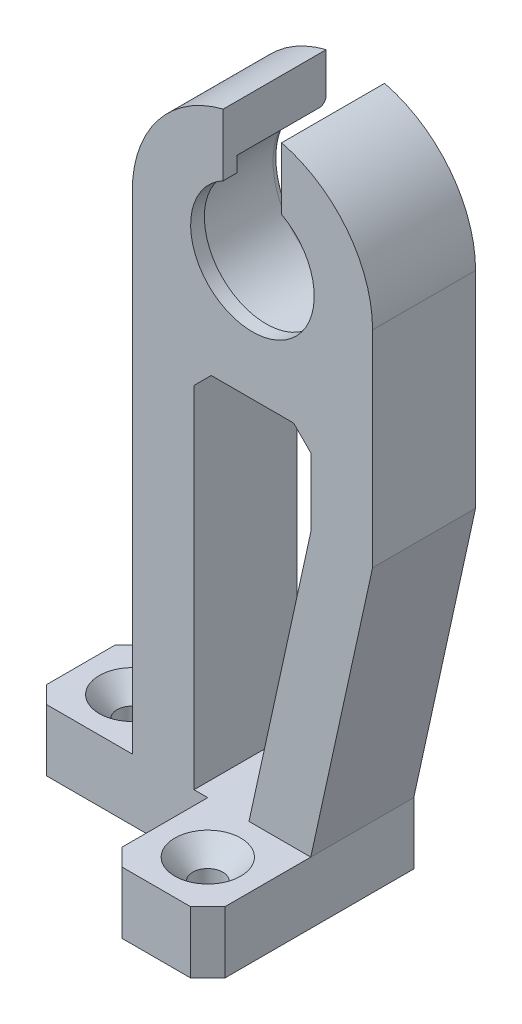
ISO-10303-21;
HEADER;
FILE_DESCRIPTION(('STEP AP214'),'2;1');
FILE_NAME('part.step','',(''),(''),'','','');
FILE_SCHEMA(('AUTOMOTIVE_DESIGN { 1 0 10303 214 1 1 1 1 }'));
ENDSEC;
DATA;
#1=APPLICATION_CONTEXT('core data for automotive mechanical design processes');
#2=APPLICATION_PROTOCOL_DEFINITION('international standard','automotive_design',2000,#1);
#3=PRODUCT_CONTEXT('',#1,'mechanical');
#4=PRODUCT('Part','Part','',(#3));
#5=PRODUCT_RELATED_PRODUCT_CATEGORY('part','',(#4));
#6=PRODUCT_DEFINITION_FORMATION('','',#4);
#7=PRODUCT_DEFINITION_CONTEXT('part definition',#1,'design');
#8=PRODUCT_DEFINITION('design','',#6,#7);
#9=PRODUCT_DEFINITION_SHAPE('','',#8);
#10=(LENGTH_UNIT() NAMED_UNIT(*) SI_UNIT(.MILLI.,.METRE.));
#11=(NAMED_UNIT(*) PLANE_ANGLE_UNIT() SI_UNIT($,.RADIAN.));
#12=(NAMED_UNIT(*) SI_UNIT($,.STERADIAN.) SOLID_ANGLE_UNIT());
#13=UNCERTAINTY_MEASURE_WITH_UNIT(LENGTH_MEASURE(1.E-05),#10,'distance_accuracy_value','');
#14=(GEOMETRIC_REPRESENTATION_CONTEXT(3) GLOBAL_UNCERTAINTY_ASSIGNED_CONTEXT((#13)) GLOBAL_UNIT_ASSIGNED_CONTEXT((#10,
#11,#12)) REPRESENTATION_CONTEXT('',''));
#15=CARTESIAN_POINT('',(0.,0.,0.));
#16=DIRECTION('',(0.,0.,1.));
#17=DIRECTION('',(1.,0.,0.));
#18=AXIS2_PLACEMENT_3D('',#15,#16,#17);
#19=CARTESIAN_POINT('',(0.,0.,15.));
#20=DIRECTION('',(0.,0.,-1.));
#21=DIRECTION('',(-1.,0.,0.));
#22=AXIS2_PLACEMENT_3D('',#19,#20,#21);
#23=CYLINDRICAL_SURFACE('',#22,11.);
#24=DIRECTION('',(0.,0.,-1.));
#25=VECTOR('',#24,1.);
#26=CARTESIAN_POINT('',(4.25,10.1458119438515,15.));
#27=LINE('',#26,#25);
#28=CARTESIAN_POINT('',(4.25,10.1458119438515,13.));
#29=VERTEX_POINT('',#28);
#30=CARTESIAN_POINT('',(4.25,10.1458119438515,1.));
#31=VERTEX_POINT('',#30);
#32=EDGE_CURVE('E389',#29,#31,#27,.T.);
#33=ORIENTED_EDGE('',*,*,#32,.T.);
#34=CARTESIAN_POINT('',(0.,0.,1.));
#35=DIRECTION('',(0.,0.,1.));
#36=DIRECTION('',(1.,0.,0.));
#37=AXIS2_PLACEMENT_3D('',#34,#35,#36);
#38=CIRCLE('',#37,11.);
#39=CARTESIAN_POINT('',(-4.25,10.1458119438515,1.));
#40=VERTEX_POINT('',#39);
#41=EDGE_CURVE('E407',#31,#40,#38,.F.);
#42=ORIENTED_EDGE('',*,*,#41,.T.);
#43=DIRECTION('',(0.,0.,-1.));
#44=VECTOR('',#43,1.);
#45=CARTESIAN_POINT('',(-4.25,10.1458119438515,15.));
#46=LINE('',#45,#44);
#47=CARTESIAN_POINT('',(-4.25,10.1458119438515,13.));
#48=VERTEX_POINT('',#47);
#49=EDGE_CURVE('E386',#48,#40,#46,.T.);
#50=ORIENTED_EDGE('',*,*,#49,.F.);
#51=CARTESIAN_POINT('',(0.,0.,13.));
#52=DIRECTION('',(0.,0.,1.));
#53=DIRECTION('',(1.,0.,0.));
#54=AXIS2_PLACEMENT_3D('',#51,#52,#53);
#55=CIRCLE('',#54,11.);
#56=EDGE_CURVE('E276',#29,#48,#55,.F.);
#57=ORIENTED_EDGE('',*,*,#56,.F.);
#58=EDGE_LOOP('',(#33,#42,#50,#57));
#59=FACE_BOUND('',#58,.T.);
#60=ADVANCED_FACE('F41',(#59),#23,.F.);
#61=CARTESIAN_POINT('',(0.,-17.5,15.));
#62=DIRECTION('',(0.,1.,0.));
#63=DIRECTION('',(0.,0.,1.));
#64=AXIS2_PLACEMENT_3D('',#61,#62,#63);
#65=PLANE('',#64);
#66=DIRECTION('',(1.,0.,0.));
#67=VECTOR('',#66,1.);
#68=CARTESIAN_POINT('',(0.,-17.5,0.));
#69=LINE('',#68,#67);
#70=CARTESIAN_POINT('',(-5.99999999999998,-17.5,0.));
#71=VERTEX_POINT('',#70);
#72=CARTESIAN_POINT('',(6.00000000000002,-17.5,0.));
#73=VERTEX_POINT('',#72);
#74=EDGE_CURVE('E346',#71,#73,#69,.T.);
#75=ORIENTED_EDGE('',*,*,#74,.T.);
#76=DIRECTION('',(0.,0.,1.));
#77=VECTOR('',#76,1.);
#78=CARTESIAN_POINT('',(6.00000000000002,-17.5,15.));
#79=LINE('',#78,#77);
#80=CARTESIAN_POINT('',(6.00000000000002,-17.5,15.));
#81=VERTEX_POINT('',#80);
#82=EDGE_CURVE('E587',#73,#81,#79,.T.);
#83=ORIENTED_EDGE('',*,*,#82,.T.);
#84=DIRECTION('',(1.,0.,0.));
#85=VECTOR('',#84,1.);
#86=CARTESIAN_POINT('',(0.,-17.5,15.));
#87=LINE('',#86,#85);
#88=CARTESIAN_POINT('',(-5.99999999999998,-17.5,15.));
#89=VERTEX_POINT('',#88);
#90=EDGE_CURVE('E306',#89,#81,#87,.T.);
#91=ORIENTED_EDGE('',*,*,#90,.F.);
#92=DIRECTION('',(0.,0.,-1.));
#93=VECTOR('',#92,1.);
#94=CARTESIAN_POINT('',(-5.99999999999998,-17.5,15.));
#95=LINE('',#94,#93);
#96=EDGE_CURVE('E584',#89,#71,#95,.T.);
#97=ORIENTED_EDGE('',*,*,#96,.T.);
#98=EDGE_LOOP('',(#75,#83,#91,#97));
#99=FACE_BOUND('',#98,.T.);
#100=ADVANCED_FACE('F435',(#99),#65,.F.);
#101=CARTESIAN_POINT('',(8.5,0.,15.));
#102=DIRECTION('',(1.,0.,0.));
#103=DIRECTION('',(0.,1.,0.));
#104=AXIS2_PLACEMENT_3D('',#101,#102,#103);
#105=PLANE('',#104);
#106=DIRECTION('',(0.,-1.,0.));
#107=VECTOR('',#106,1.);
#108=CARTESIAN_POINT('',(8.5,0.,15.));
#109=LINE('',#108,#107);
#110=CARTESIAN_POINT('',(8.5,-20.,15.));
#111=VERTEX_POINT('',#110);
#112=CARTESIAN_POINT('',(8.50000000000001,-30.,15.));
#113=VERTEX_POINT('',#112);
#114=EDGE_CURVE('E309',#111,#113,#109,.T.);
#115=ORIENTED_EDGE('',*,*,#114,.F.);
#116=DIRECTION('',(0.,0.,-1.));
#117=VECTOR('',#116,1.);
#118=CARTESIAN_POINT('',(8.5,-20.,0.));
#119=LINE('',#118,#117);
#120=CARTESIAN_POINT('',(8.5,-20.,0.));
#121=VERTEX_POINT('',#120);
#122=EDGE_CURVE('E581',#111,#121,#119,.T.);
#123=ORIENTED_EDGE('',*,*,#122,.T.);
#124=DIRECTION('',(0.,-1.,0.));
#125=VECTOR('',#124,1.);
#126=CARTESIAN_POINT('',(8.5,0.,0.));
#127=LINE('',#126,#125);
#128=CARTESIAN_POINT('',(8.50000000000001,-30.,0.));
#129=VERTEX_POINT('',#128);
#130=EDGE_CURVE('E349',#121,#129,#127,.T.);
#131=ORIENTED_EDGE('',*,*,#130,.T.);
#132=DIRECTION('',(0.,0.,-1.));
#133=VECTOR('',#132,1.);
#134=CARTESIAN_POINT('',(8.50000000000001,-30.,15.));
#135=LINE('',#134,#133);
#136=EDGE_CURVE('E364',#113,#129,#135,.T.);
#137=ORIENTED_EDGE('',*,*,#136,.F.);
#138=EDGE_LOOP('',(#115,#123,#131,#137));
#139=FACE_BOUND('',#138,.T.);
#140=ADVANCED_FACE('F440',(#139),#105,.F.);
#141=CARTESIAN_POINT('',(14.3918842224745,-3.15919409761635,15.));
#142=DIRECTION('',(0.976744343171884,-0.214407294842609,0.));
#143=DIRECTION('',(0.214407294842609,0.976744343171884,0.));
#144=AXIS2_PLACEMENT_3D('',#141,#142,#143);
#145=PLANE('',#144);
#146=DIRECTION('',(-0.214407294842609,-0.976744343171884,0.));
#147=VECTOR('',#146,1.);
#148=CARTESIAN_POINT('',(14.3918842224745,-3.15919409761635,0.));
#149=LINE('',#148,#147);
#150=CARTESIAN_POINT('',(-0.5,-71.,0.));
#151=VERTEX_POINT('',#150);
#152=EDGE_CURVE('E351',#129,#151,#149,.T.);
#153=ORIENTED_EDGE('',*,*,#152,.T.);
#154=DIRECTION('',(0.,0.,-1.));
#155=VECTOR('',#154,1.);
#156=CARTESIAN_POINT('',(-0.5,-71.,15.));
#157=LINE('',#156,#155);
#158=CARTESIAN_POINT('',(-0.5,-71.,15.));
#159=VERTEX_POINT('',#158);
#160=EDGE_CURVE('E361',#159,#151,#157,.T.);
#161=ORIENTED_EDGE('',*,*,#160,.F.);
#162=DIRECTION('',(-0.214407294842609,-0.976744343171884,0.));
#163=VECTOR('',#162,1.);
#164=CARTESIAN_POINT('',(14.3918842224745,-3.15919409761635,15.));
#165=LINE('',#164,#163);
#166=EDGE_CURVE('E311',#113,#159,#165,.T.);
#167=ORIENTED_EDGE('',*,*,#166,.F.);
#168=ORIENTED_EDGE('',*,*,#136,.T.);
#169=EDGE_LOOP('',(#153,#161,#167,#168));
#170=FACE_BOUND('',#169,.T.);
#171=ADVANCED_FACE('F431',(#170),#145,.F.);
#172=CARTESIAN_POINT('',(-1.23165366794353E-13,-71.,15.));
#173=DIRECTION('',(0.,1.,0.));
#174=DIRECTION('',(-1.,0.,0.));
#175=AXIS2_PLACEMENT_3D('',#172,#173,#174);
#176=PLANE('',#175);
#177=CARTESIAN_POINT('',(0.999999999999994,-71.,22.5));
#178=DIRECTION('',(0.,-1.,0.));
#179=DIRECTION('',(0.,0.,-1.));
#180=AXIS2_PLACEMENT_3D('',#177,#178,#179);
#181=CIRCLE('',#180,4.80786021344867);
#182=CARTESIAN_POINT('',(0.999999999999994,-71.,17.6921397865513));
#183=VERTEX_POINT('',#182);
#184=EDGE_CURVE('E547',#183,#183,#181,.T.);
#185=ORIENTED_EDGE('',*,*,#184,.T.);
#186=EDGE_LOOP('',(#185));
#187=FACE_BOUND('',#186,.T.);
#188=DIRECTION('',(-1.,0.,0.));
#189=VECTOR('',#188,1.);
#190=CARTESIAN_POINT('',(-6.50000000000001,-71.,30.));
#191=LINE('',#190,#189);
#192=CARTESIAN_POINT('',(6.00000000000001,-71.,30.));
#193=VERTEX_POINT('',#192);
#194=CARTESIAN_POINT('',(-4.,-71.,30.));
#195=VERTEX_POINT('',#194);
#196=EDGE_CURVE('E263',#193,#195,#191,.T.);
#197=ORIENTED_EDGE('',*,*,#196,.F.);
#198=DIRECTION('',(-0.707106781186546,0.,0.707106781186549));
#199=VECTOR('',#198,1.);
#200=CARTESIAN_POINT('',(10.5,-71.,25.5));
#201=LINE('',#200,#199);
#202=CARTESIAN_POINT('',(8.49999999999999,-71.,27.5));
#203=VERTEX_POINT('',#202);
#204=EDGE_CURVE('E57',#193,#203,#201,.F.);
#205=ORIENTED_EDGE('',*,*,#204,.T.);
#206=DIRECTION('',(0.,0.,-1.));
#207=VECTOR('',#206,1.);
#208=CARTESIAN_POINT('',(8.49999999999999,-71.,30.));
#209=LINE('',#208,#207);
#210=CARTESIAN_POINT('',(8.49999999999999,-71.,15.));
#211=VERTEX_POINT('',#210);
#212=EDGE_CURVE('E238',#203,#211,#209,.T.);
#213=ORIENTED_EDGE('',*,*,#212,.T.);
#214=DIRECTION('',(-1.,0.,0.));
#215=VECTOR('',#214,1.);
#216=CARTESIAN_POINT('',(-6.50000000000001,-71.,15.));
#217=LINE('',#216,#215);
#218=EDGE_CURVE('E254',#211,#159,#217,.T.);
#219=ORIENTED_EDGE('',*,*,#218,.T.);
#220=ORIENTED_EDGE('',*,*,#160,.T.);
#221=DIRECTION('',(1.,0.,0.));
#222=VECTOR('',#221,1.);
#223=CARTESIAN_POINT('',(-1.23165366794353E-13,-71.,0.));
#224=LINE('',#223,#222);
#225=CARTESIAN_POINT('',(-8.49999999999999,-71.,0.));
#226=VERTEX_POINT('',#225);
#227=EDGE_CURVE('E354',#226,#151,#224,.T.);
#228=ORIENTED_EDGE('',*,*,#227,.F.);
#229=DIRECTION('',(0.,0.,-1.));
#230=VECTOR('',#229,1.);
#231=CARTESIAN_POINT('',(-8.49999999999999,-71.,15.));
#232=LINE('',#231,#230);
#233=CARTESIAN_POINT('',(-8.49999999999999,-71.,15.));
#234=VERTEX_POINT('',#233);
#235=EDGE_CURVE('E358',#234,#226,#232,.T.);
#236=ORIENTED_EDGE('',*,*,#235,.F.);
#237=DIRECTION('',(1.,0.,0.));
#238=VECTOR('',#237,1.);
#239=CARTESIAN_POINT('',(-1.23165366794353E-13,-71.,15.));
#240=LINE('',#239,#238);
#241=CARTESIAN_POINT('',(-6.50000000000001,-71.,15.));
#242=VERTEX_POINT('',#241);
#243=EDGE_CURVE('E314',#234,#242,#240,.T.);
#244=ORIENTED_EDGE('',*,*,#243,.T.);
#245=DIRECTION('',(0.,0.,-1.));
#246=VECTOR('',#245,1.);
#247=CARTESIAN_POINT('',(-6.50000000000001,-71.,30.));
#248=LINE('',#247,#246);
#249=CARTESIAN_POINT('',(-6.50000000000001,-71.,27.5));
#250=VERTEX_POINT('',#249);
#251=EDGE_CURVE('E253',#250,#242,#248,.T.);
#252=ORIENTED_EDGE('',*,*,#251,.F.);
#253=DIRECTION('',(0.707106781186546,0.,0.707106781186549));
#254=VECTOR('',#253,1.);
#255=CARTESIAN_POINT('',(-9.50000000000007,-71.,24.4999999999999));
#256=LINE('',#255,#254);
#257=EDGE_CURVE('E567',#250,#195,#256,.T.);
#258=ORIENTED_EDGE('',*,*,#257,.T.);
#259=EDGE_LOOP('',(#197,#205,#213,#219,#220,#228,#236,#244,#252,#258));
#260=FACE_BOUND('',#259,.T.);
#261=ADVANCED_FACE('F426',(#187,#260),#176,.T.);
#262=CARTESIAN_POINT('',(17.5,0.,15.));
#263=DIRECTION('',(-1.,0.,0.));
#264=DIRECTION('',(0.,0.,1.));
#265=AXIS2_PLACEMENT_3D('',#262,#263,#264);
#266=PLANE('',#265);
#267=DIRECTION('',(0.,1.,0.));
#268=VECTOR('',#267,1.);
#269=CARTESIAN_POINT('',(17.5,0.,0.));
#270=LINE('',#269,#268);
#271=CARTESIAN_POINT('',(17.5,-30.,0.));
#272=VERTEX_POINT('',#271);
#273=CARTESIAN_POINT('',(17.5,0.,0.));
#274=VERTEX_POINT('',#273);
#275=EDGE_CURVE('E285',#272,#274,#270,.T.);
#276=ORIENTED_EDGE('',*,*,#275,.T.);
#277=DIRECTION('',(0.,0.,-1.));
#278=VECTOR('',#277,1.);
#279=CARTESIAN_POINT('',(17.5,0.,15.));
#280=LINE('',#279,#278);
#281=CARTESIAN_POINT('',(17.5,0.,15.));
#282=VERTEX_POINT('',#281);
#283=EDGE_CURVE('E362',#282,#274,#280,.T.);
#284=ORIENTED_EDGE('',*,*,#283,.F.);
#285=DIRECTION('',(0.,1.,0.));
#286=VECTOR('',#285,1.);
#287=CARTESIAN_POINT('',(17.5,0.,15.));
#288=LINE('',#287,#286);
#289=CARTESIAN_POINT('',(17.5,-30.,15.));
#290=VERTEX_POINT('',#289);
#291=EDGE_CURVE('E288',#290,#282,#288,.T.);
#292=ORIENTED_EDGE('',*,*,#291,.F.);
#293=DIRECTION('',(0.,0.,-1.));
#294=VECTOR('',#293,1.);
#295=CARTESIAN_POINT('',(17.5,-30.,15.));
#296=LINE('',#295,#294);
#297=EDGE_CURVE('E318',#290,#272,#296,.T.);
#298=ORIENTED_EDGE('',*,*,#297,.T.);
#299=EDGE_LOOP('',(#276,#284,#292,#298));
#300=FACE_BOUND('',#299,.T.);
#301=ADVANCED_FACE('F423',(#300),#266,.F.);
#302=CARTESIAN_POINT('',(0.,0.,15.));
#303=DIRECTION('',(0.,0.,-1.));
#304=DIRECTION('',(-1.,0.,0.));
#305=AXIS2_PLACEMENT_3D('',#302,#303,#304);
#306=CYLINDRICAL_SURFACE('',#305,17.5);
#307=CARTESIAN_POINT('',(0.,0.,0.));
#308=DIRECTION('',(0.,0.,1.));
#309=DIRECTION('',(1.,0.,0.));
#310=AXIS2_PLACEMENT_3D('',#307,#308,#309);
#311=CIRCLE('',#310,17.5);
#312=CARTESIAN_POINT('',(4.25,16.976086121365,0.));
#313=VERTEX_POINT('',#312);
#314=EDGE_CURVE('E321',#274,#313,#311,.T.);
#315=ORIENTED_EDGE('',*,*,#314,.T.);
#316=DIRECTION('',(0.,0.,-1.));
#317=VECTOR('',#316,1.);
#318=CARTESIAN_POINT('',(4.25,16.976086121365,15.));
#319=LINE('',#318,#317);
#320=CARTESIAN_POINT('',(4.25,16.976086121365,15.));
#321=VERTEX_POINT('',#320);
#322=EDGE_CURVE('E392',#321,#313,#319,.T.);
#323=ORIENTED_EDGE('',*,*,#322,.F.);
#324=CARTESIAN_POINT('',(0.,0.,15.));
#325=DIRECTION('',(0.,0.,1.));
#326=DIRECTION('',(1.,0.,0.));
#327=AXIS2_PLACEMENT_3D('',#324,#325,#326);
#328=CIRCLE('',#327,17.5);
#329=EDGE_CURVE('E291',#282,#321,#328,.T.);
#330=ORIENTED_EDGE('',*,*,#329,.F.);
#331=ORIENTED_EDGE('',*,*,#283,.T.);
#332=EDGE_LOOP('',(#315,#323,#330,#331));
#333=FACE_BOUND('',#332,.T.);
#334=ADVANCED_FACE('F419',(#333),#306,.T.);
#335=CARTESIAN_POINT('',(4.25,0.,15.));
#336=DIRECTION('',(1.,0.,0.));
#337=DIRECTION('',(0.,0.,-1.));
#338=AXIS2_PLACEMENT_3D('',#335,#336,#337);
#339=PLANE('',#338);
#340=DIRECTION('',(0.,-1.,0.));
#341=VECTOR('',#340,1.);
#342=CARTESIAN_POINT('',(4.25,0.,0.));
#343=LINE('',#342,#341);
#344=CARTESIAN_POINT('',(4.25,11.2221878437317,0.));
#345=VERTEX_POINT('',#344);
#346=EDGE_CURVE('E323',#313,#345,#343,.T.);
#347=ORIENTED_EDGE('',*,*,#346,.T.);
#348=CARTESIAN_POINT('',(4.25,11.2221878437317,0.));
#349=CARTESIAN_POINT('',(4.25,11.1583395817592,-3.0000049319474E-05));
#350=CARTESIAN_POINT('',(4.25,11.0944916848489,0.00534684254006916));
#351=CARTESIAN_POINT('',(4.25,10.9685051190463,0.0266415869899688));
#352=CARTESIAN_POINT('',(4.25,10.9063684507458,0.0425713231365217));
#353=CARTESIAN_POINT('',(4.25,10.7856097346543,0.0847170694115298));
#354=CARTESIAN_POINT('',(4.25,10.7269909146085,0.110942364604347));
#355=CARTESIAN_POINT('',(4.25,10.6151941753337,0.173137249708884));
#356=CARTESIAN_POINT('',(4.25,10.5620129248735,0.209100823760954));
#357=CARTESIAN_POINT('',(4.25,10.4644221812902,0.288782010833055));
#358=CARTESIAN_POINT('',(4.25,10.4197984155315,0.332236437308677));
#359=CARTESIAN_POINT('',(4.25,10.3391494373158,0.42654341846053));
#360=CARTESIAN_POINT('',(4.25,10.303123297967,0.477395174694179));
#361=CARTESIAN_POINT('',(4.25,10.2435174342038,0.581159894120742));
#362=CARTESIAN_POINT('',(4.25,10.2192355092847,0.633670025049938));
#363=CARTESIAN_POINT('',(4.25,10.1806360078176,0.74219108724674));
#364=CARTESIAN_POINT('',(4.25,10.1663003344697,0.798195457377362));
#365=CARTESIAN_POINT('',(4.25,10.1534588676889,0.878965390171643));
#366=CARTESIAN_POINT('',(4.25,10.1505922030188,0.903100579551488));
#367=CARTESIAN_POINT('',(4.25,10.1467704706926,0.951486110929542));
#368=CARTESIAN_POINT('',(4.25,10.1458125993548,0.97573623151643));
#369=CARTESIAN_POINT('',(4.25,10.1458119438515,1.));
#370=B_SPLINE_CURVE_WITH_KNOTS('',3,(#348,#349,#350,#351,#352,#353,#354,#355,#356,#357,#358,
#359,#360,#361,#362,#363,#364,#365,#366,#367,#368,#369),.UNSPECIFIED.,.F.,.F.,(4,2,2,2,2,2,2,2,
2,2,4),(0.,0.191323292335232,0.38286150355206,0.574572852067377,0.766166039274555,
0.95204628292609,1.13790647816349,1.31056773911045,1.48291402022096,1.55576652511065,
1.62851194337912),.UNSPECIFIED.);
#371=EDGE_CURVE('E399',#345,#31,#370,.T.);
#372=ORIENTED_EDGE('',*,*,#371,.T.);
#373=ORIENTED_EDGE('',*,*,#32,.F.);
#374=DIRECTION('',(0.,-1.,0.));
#375=VECTOR('',#374,1.);
#376=CARTESIAN_POINT('',(4.25,0.,13.));
#377=LINE('',#376,#375);
#378=CARTESIAN_POINT('',(4.25,7.93331582631122,13.));
#379=VERTEX_POINT('',#378);
#380=EDGE_CURVE('E268',#29,#379,#377,.T.);
#381=ORIENTED_EDGE('',*,*,#380,.T.);
#382=DIRECTION('',(0.,0.,1.));
#383=VECTOR('',#382,1.);
#384=CARTESIAN_POINT('',(4.25,7.93331582631122,13.));
#385=LINE('',#384,#383);
#386=CARTESIAN_POINT('',(4.25,7.93331582631122,15.));
#387=VERTEX_POINT('',#386);
#388=EDGE_CURVE('E279',#379,#387,#385,.T.);
#389=ORIENTED_EDGE('',*,*,#388,.T.);
#390=DIRECTION('',(0.,-1.,0.));
#391=VECTOR('',#390,1.);
#392=CARTESIAN_POINT('',(4.25,0.,15.));
#393=LINE('',#392,#391);
#394=EDGE_CURVE('E294',#321,#387,#393,.T.);
#395=ORIENTED_EDGE('',*,*,#394,.F.);
#396=ORIENTED_EDGE('',*,*,#322,.T.);
#397=EDGE_LOOP('',(#347,#372,#373,#381,#389,#395,#396));
#398=FACE_BOUND('',#397,.T.);
#399=ADVANCED_FACE('F413',(#398),#339,.F.);
#400=CARTESIAN_POINT('',(-4.25,0.,15.));
#401=DIRECTION('',(-1.,0.,0.));
#402=DIRECTION('',(0.,0.,1.));
#403=AXIS2_PLACEMENT_3D('',#400,#401,#402);
#404=PLANE('',#403);
#405=ORIENTED_EDGE('',*,*,#49,.T.);
#406=CARTESIAN_POINT('',(-4.25,10.1458119438515,1.));
#407=CARTESIAN_POINT('',(-4.25,10.1458108735423,0.973395576400315));
#408=CARTESIAN_POINT('',(-4.25,10.1469638395564,0.946804559012869));
#409=CARTESIAN_POINT('',(-4.25,10.1515550450408,0.893826357710576));
#410=CARTESIAN_POINT('',(-4.25,10.1549927799568,0.867439130093268));
#411=CARTESIAN_POINT('',(-4.25,10.1686647813517,0.789031282276641));
#412=CARTESIAN_POINT('',(-4.25,10.1822582471187,0.737558464762993));
#413=CARTESIAN_POINT('',(-4.25,10.2178399264313,0.637666094587101));
#414=CARTESIAN_POINT('',(-4.25,10.2398252128011,0.589245484129616));
#415=CARTESIAN_POINT('',(-4.25,10.2913577962062,0.496593616682435));
#416=CARTESIAN_POINT('',(-4.25,10.3209086455735,0.452364341094024));
#417=CARTESIAN_POINT('',(-4.25,10.3876735395218,0.367680586041679));
#418=CARTESIAN_POINT('',(-4.25,10.4251127640972,0.327404133332133));
#419=CARTESIAN_POINT('',(-4.25,10.5058087766385,0.253183594946056));
#420=CARTESIAN_POINT('',(-4.25,10.5490672219816,0.219241319910768));
#421=CARTESIAN_POINT('',(-4.25,10.6435354111256,0.156048050417647));
#422=CARTESIAN_POINT('',(-4.25,10.6950950676092,0.127320351534621));
#423=CARTESIAN_POINT('',(-4.25,10.8020978120165,0.0783315984001153));
#424=CARTESIAN_POINT('',(-4.25,10.8575419796582,0.0580729091378657));
#425=CARTESIAN_POINT('',(-4.25,10.9642934360648,0.02821218700798));
#426=CARTESIAN_POINT('',(-4.25,11.0153342651279,0.0176463912123784));
#427=CARTESIAN_POINT('',(-4.25,11.1183104469153,0.00353938132545975));
#428=CARTESIAN_POINT('',(-4.25,11.1702445593202,-1.08867587109036E-05));
#429=CARTESIAN_POINT('',(-4.25,11.2221878437317,0.));
#430=B_SPLINE_CURVE_WITH_KNOTS('',3,(#406,#407,#408,#409,#410,#411,#412,#413,#414,#415,#416,
#417,#418,#419,#420,#421,#422,#423,#424,#425,#426,#427,#428,#429),.UNSPECIFIED.,.F.,.F.,(4,2,2,
2,2,2,2,2,2,2,2,4),(0.,0.0797620160480001,0.159506423794101,0.318385351247416,0.477208910240669,
0.636107180401895,0.800374082640462,0.964687869316413,1.14099577393669,1.31735288008472,
1.47324688540963,1.62893956768402),.UNSPECIFIED.);
#431=CARTESIAN_POINT('',(-4.25,11.2221878437317,0.));
#432=VERTEX_POINT('',#431);
#433=EDGE_CURVE('E449',#40,#432,#430,.T.);
#434=ORIENTED_EDGE('',*,*,#433,.T.);
#435=DIRECTION('',(0.,1.,0.));
#436=VECTOR('',#435,1.);
#437=CARTESIAN_POINT('',(-4.25,0.,0.));
#438=LINE('',#437,#436);
#439=CARTESIAN_POINT('',(-4.25,16.976086121365,0.));
#440=VERTEX_POINT('',#439);
#441=EDGE_CURVE('E326',#432,#440,#438,.T.);
#442=ORIENTED_EDGE('',*,*,#441,.T.);
#443=DIRECTION('',(0.,0.,-1.));
#444=VECTOR('',#443,1.);
#445=CARTESIAN_POINT('',(-4.25,16.976086121365,15.));
#446=LINE('',#445,#444);
#447=CARTESIAN_POINT('',(-4.25,16.976086121365,15.));
#448=VERTEX_POINT('',#447);
#449=EDGE_CURVE('E383',#448,#440,#446,.T.);
#450=ORIENTED_EDGE('',*,*,#449,.F.);
#451=DIRECTION('',(0.,1.,0.));
#452=VECTOR('',#451,1.);
#453=CARTESIAN_POINT('',(-4.25,0.,15.));
#454=LINE('',#453,#452);
#455=CARTESIAN_POINT('',(-4.25,7.93331582631121,15.));
#456=VERTEX_POINT('',#455);
#457=EDGE_CURVE('E296',#456,#448,#454,.T.);
#458=ORIENTED_EDGE('',*,*,#457,.F.);
#459=DIRECTION('',(0.,0.,1.));
#460=VECTOR('',#459,1.);
#461=CARTESIAN_POINT('',(-4.25,7.93331582631121,13.));
#462=LINE('',#461,#460);
#463=CARTESIAN_POINT('',(-4.25,7.93331582631121,13.));
#464=VERTEX_POINT('',#463);
#465=EDGE_CURVE('E282',#464,#456,#462,.T.);
#466=ORIENTED_EDGE('',*,*,#465,.F.);
#467=DIRECTION('',(0.,-1.,0.));
#468=VECTOR('',#467,1.);
#469=CARTESIAN_POINT('',(-4.25,0.,13.));
#470=LINE('',#469,#468);
#471=EDGE_CURVE('E274',#48,#464,#470,.T.);
#472=ORIENTED_EDGE('',*,*,#471,.F.);
#473=EDGE_LOOP('',(#405,#434,#442,#450,#458,#466,#472));
#474=FACE_BOUND('',#473,.T.);
#475=ADVANCED_FACE('F418',(#474),#404,.F.);
#476=CARTESIAN_POINT('',(0.,0.,15.));
#477=DIRECTION('',(0.,0.,-1.));
#478=DIRECTION('',(-1.,0.,0.));
#479=AXIS2_PLACEMENT_3D('',#476,#477,#478);
#480=CYLINDRICAL_SURFACE('',#479,17.5);
#481=CARTESIAN_POINT('',(0.,0.,0.));
#482=DIRECTION('',(0.,0.,1.));
#483=DIRECTION('',(1.,0.,0.));
#484=AXIS2_PLACEMENT_3D('',#481,#482,#483);
#485=CIRCLE('',#484,17.5);
#486=CARTESIAN_POINT('',(-17.5,0.,0.));
#487=VERTEX_POINT('',#486);
#488=EDGE_CURVE('E328',#440,#487,#485,.T.);
#489=ORIENTED_EDGE('',*,*,#488,.T.);
#490=DIRECTION('',(0.,0.,-1.));
#491=VECTOR('',#490,1.);
#492=CARTESIAN_POINT('',(-17.5,0.,15.));
#493=LINE('',#492,#491);
#494=CARTESIAN_POINT('',(-17.5,0.,15.));
#495=VERTEX_POINT('',#494);
#496=EDGE_CURVE('E381',#495,#487,#493,.T.);
#497=ORIENTED_EDGE('',*,*,#496,.F.);
#498=CARTESIAN_POINT('',(0.,0.,15.));
#499=DIRECTION('',(0.,0.,1.));
#500=DIRECTION('',(1.,0.,0.));
#501=AXIS2_PLACEMENT_3D('',#498,#499,#500);
#502=CIRCLE('',#501,17.5);
#503=EDGE_CURVE('E298',#448,#495,#502,.T.);
#504=ORIENTED_EDGE('',*,*,#503,.F.);
#505=ORIENTED_EDGE('',*,*,#449,.T.);
#506=EDGE_LOOP('',(#489,#497,#504,#505));
#507=FACE_BOUND('',#506,.T.);
#508=ADVANCED_FACE('F463',(#507),#480,.T.);
#509=CARTESIAN_POINT('',(-17.5,0.,15.));
#510=DIRECTION('',(-1.,0.,0.));
#511=DIRECTION('',(0.,0.,1.));
#512=AXIS2_PLACEMENT_3D('',#509,#510,#511);
#513=PLANE('',#512);
#514=DIRECTION('',(0.,1.,0.));
#515=VECTOR('',#514,1.);
#516=CARTESIAN_POINT('',(-17.5,0.,0.));
#517=LINE('',#516,#515);
#518=CARTESIAN_POINT('',(-17.5,-71.,0.));
#519=VERTEX_POINT('',#518);
#520=EDGE_CURVE('E331',#519,#487,#517,.T.);
#521=ORIENTED_EDGE('',*,*,#520,.F.);
#522=DIRECTION('',(0.,0.,-1.));
#523=VECTOR('',#522,1.);
#524=CARTESIAN_POINT('',(-17.5,-71.,15.));
#525=LINE('',#524,#523);
#526=CARTESIAN_POINT('',(-17.5,-71.,15.));
#527=VERTEX_POINT('',#526);
#528=EDGE_CURVE('E379',#527,#519,#525,.T.);
#529=ORIENTED_EDGE('',*,*,#528,.F.);
#530=DIRECTION('',(0.,1.,0.));
#531=VECTOR('',#530,1.);
#532=CARTESIAN_POINT('',(-17.5,0.,15.));
#533=LINE('',#532,#531);
#534=EDGE_CURVE('E300',#527,#495,#533,.T.);
#535=ORIENTED_EDGE('',*,*,#534,.T.);
#536=ORIENTED_EDGE('',*,*,#496,.T.);
#537=EDGE_LOOP('',(#521,#529,#535,#536));
#538=FACE_BOUND('',#537,.T.);
#539=ADVANCED_FACE('F466',(#538),#513,.T.);
#540=CARTESIAN_POINT('',(0.,-71.,15.));
#541=DIRECTION('',(0.,-1.,0.));
#542=DIRECTION('',(0.,0.,-1.));
#543=AXIS2_PLACEMENT_3D('',#540,#541,#542);
#544=PLANE('',#543);
#545=CARTESIAN_POINT('',(-25.,-71.,7.5));
#546=DIRECTION('',(0.,1.,0.));
#547=DIRECTION('',(0.,0.,1.));
#548=AXIS2_PLACEMENT_3D('',#545,#546,#547);
#549=CIRCLE('',#548,4.80786021344867);
#550=CARTESIAN_POINT('',(-25.,-71.,12.3078602134487));
#551=VERTEX_POINT('',#550);
#552=EDGE_CURVE('E255',#551,#551,#549,.T.);
#553=ORIENTED_EDGE('',*,*,#552,.F.);
#554=EDGE_LOOP('',(#553));
#555=FACE_BOUND('',#554,.T.);
#556=DIRECTION('',(0.,0.,-1.));
#557=VECTOR('',#556,1.);
#558=CARTESIAN_POINT('',(-32.5,-71.,15.));
#559=LINE('',#558,#557);
#560=CARTESIAN_POINT('',(-32.5,-71.,12.5));
#561=VERTEX_POINT('',#560);
#562=CARTESIAN_POINT('',(-32.5,-71.,2.50000000000002));
#563=VERTEX_POINT('',#562);
#564=EDGE_CURVE('E376',#561,#563,#559,.T.);
#565=ORIENTED_EDGE('',*,*,#564,.F.);
#566=DIRECTION('',(-0.707106781186549,0.,-0.707106781186546));
#567=VECTOR('',#566,1.);
#568=CARTESIAN_POINT('',(-32.5,-71.,12.5));
#569=LINE('',#568,#567);
#570=CARTESIAN_POINT('',(-30.,-71.,15.));
#571=VERTEX_POINT('',#570);
#572=EDGE_CURVE('E641',#561,#571,#569,.F.);
#573=ORIENTED_EDGE('',*,*,#572,.T.);
#574=DIRECTION('',(-1.,0.,0.));
#575=VECTOR('',#574,1.);
#576=CARTESIAN_POINT('',(0.,-71.,15.));
#577=LINE('',#576,#575);
#578=EDGE_CURVE('E250',#527,#571,#577,.T.);
#579=ORIENTED_EDGE('',*,*,#578,.F.);
#580=ORIENTED_EDGE('',*,*,#528,.T.);
#581=DIRECTION('',(-1.,0.,0.));
#582=VECTOR('',#581,1.);
#583=CARTESIAN_POINT('',(0.,-71.,0.));
#584=LINE('',#583,#582);
#585=CARTESIAN_POINT('',(-30.,-71.,0.));
#586=VERTEX_POINT('',#585);
#587=EDGE_CURVE('E334',#519,#586,#584,.T.);
#588=ORIENTED_EDGE('',*,*,#587,.T.);
#589=DIRECTION('',(-0.707106781186546,0.,0.707106781186549));
#590=VECTOR('',#589,1.);
#591=CARTESIAN_POINT('',(-30.,-71.,0.));
#592=LINE('',#591,#590);
#593=EDGE_CURVE('E646',#586,#563,#592,.T.);
#594=ORIENTED_EDGE('',*,*,#593,.T.);
#595=EDGE_LOOP('',(#565,#573,#579,#580,#588,#594));
#596=FACE_BOUND('',#595,.T.);
#597=ADVANCED_FACE('F470',(#555,#596),#544,.F.);
#598=CARTESIAN_POINT('',(-32.5,0.,15.));
#599=DIRECTION('',(-1.,0.,0.));
#600=DIRECTION('',(0.,0.,1.));
#601=AXIS2_PLACEMENT_3D('',#598,#599,#600);
#602=PLANE('',#601);
#603=DIRECTION('',(0.,0.,-1.));
#604=VECTOR('',#603,1.);
#605=CARTESIAN_POINT('',(-32.5,-80.,15.));
#606=LINE('',#605,#604);
#607=CARTESIAN_POINT('',(-32.5,-80.,12.5));
#608=VERTEX_POINT('',#607);
#609=CARTESIAN_POINT('',(-32.5,-80.,2.50000000000002));
#610=VERTEX_POINT('',#609);
#611=EDGE_CURVE('E373',#608,#610,#606,.T.);
#612=ORIENTED_EDGE('',*,*,#611,.F.);
#613=DIRECTION('',(0.,1.,0.));
#614=VECTOR('',#613,1.);
#615=CARTESIAN_POINT('',(-32.5,0.,12.5));
#616=LINE('',#615,#614);
#617=EDGE_CURVE('E453',#608,#561,#616,.T.);
#618=ORIENTED_EDGE('',*,*,#617,.T.);
#619=ORIENTED_EDGE('',*,*,#564,.T.);
#620=DIRECTION('',(0.,-1.,0.));
#621=VECTOR('',#620,1.);
#622=CARTESIAN_POINT('',(-32.5,-80.,2.50000000000002));
#623=LINE('',#622,#621);
#624=EDGE_CURVE('E450',#563,#610,#623,.T.);
#625=ORIENTED_EDGE('',*,*,#624,.T.);
#626=EDGE_LOOP('',(#612,#618,#619,#625));
#627=FACE_BOUND('',#626,.T.);
#628=ADVANCED_FACE('F474',(#627),#602,.T.);
#629=CARTESIAN_POINT('',(0.,-80.,15.));
#630=DIRECTION('',(0.,1.,0.));
#631=DIRECTION('',(0.,0.,1.));
#632=AXIS2_PLACEMENT_3D('',#629,#630,#631);
#633=PLANE('',#632);
#634=CARTESIAN_POINT('',(0.999999999999994,-80.,22.5));
#635=DIRECTION('',(0.,-1.,0.));
#636=DIRECTION('',(0.,0.,-1.));
#637=AXIS2_PLACEMENT_3D('',#634,#635,#636);
#638=CIRCLE('',#637,2.2);
#639=CARTESIAN_POINT('',(0.999999999999994,-80.,20.3));
#640=VERTEX_POINT('',#639);
#641=EDGE_CURVE('E545',#640,#640,#638,.T.);
#642=ORIENTED_EDGE('',*,*,#641,.F.);
#643=EDGE_LOOP('',(#642));
#644=FACE_BOUND('',#643,.T.);
#645=CARTESIAN_POINT('',(-25.,-80.,7.5));
#646=DIRECTION('',(0.,1.,0.));
#647=DIRECTION('',(0.,0.,1.));
#648=AXIS2_PLACEMENT_3D('',#645,#646,#647);
#649=CIRCLE('',#648,2.2);
#650=CARTESIAN_POINT('',(-25.,-80.,9.7));
#651=VERTEX_POINT('',#650);
#652=EDGE_CURVE('E552',#651,#651,#649,.T.);
#653=ORIENTED_EDGE('',*,*,#652,.T.);
#654=EDGE_LOOP('',(#653));
#655=FACE_BOUND('',#654,.T.);
#656=DIRECTION('',(1.,0.,0.));
#657=VECTOR('',#656,1.);
#658=CARTESIAN_POINT('',(0.,-80.,15.));
#659=LINE('',#658,#657);
#660=CARTESIAN_POINT('',(-30.,-80.,15.));
#661=VERTEX_POINT('',#660);
#662=CARTESIAN_POINT('',(-6.50000000000001,-80.,15.));
#663=VERTEX_POINT('',#662);
#664=EDGE_CURVE('E232',#661,#663,#659,.T.);
#665=ORIENTED_EDGE('',*,*,#664,.F.);
#666=DIRECTION('',(0.707106781186549,0.,0.707106781186546));
#667=VECTOR('',#666,1.);
#668=CARTESIAN_POINT('',(-32.5,-80.,12.5));
#669=LINE('',#668,#667);
#670=EDGE_CURVE('E572',#661,#608,#669,.F.);
#671=ORIENTED_EDGE('',*,*,#670,.T.);
#672=ORIENTED_EDGE('',*,*,#611,.T.);
#673=DIRECTION('',(0.707106781186546,0.,-0.707106781186549));
#674=VECTOR('',#673,1.);
#675=CARTESIAN_POINT('',(-30.,-80.,0.));
#676=LINE('',#675,#674);
#677=CARTESIAN_POINT('',(-30.,-80.,0.));
#678=VERTEX_POINT('',#677);
#679=EDGE_CURVE('E651',#610,#678,#676,.T.);
#680=ORIENTED_EDGE('',*,*,#679,.T.);
#681=DIRECTION('',(1.,0.,0.));
#682=VECTOR('',#681,1.);
#683=CARTESIAN_POINT('',(0.,-80.,0.));
#684=LINE('',#683,#682);
#685=CARTESIAN_POINT('',(8.49999999999999,-80.,0.));
#686=VERTEX_POINT('',#685);
#687=EDGE_CURVE('E337',#678,#686,#684,.T.);
#688=ORIENTED_EDGE('',*,*,#687,.T.);
#689=DIRECTION('',(0.,0.,-1.));
#690=VECTOR('',#689,1.);
#691=CARTESIAN_POINT('',(8.49999999999999,-80.,15.));
#692=LINE('',#691,#690);
#693=CARTESIAN_POINT('',(8.49999999999999,-80.,27.5));
#694=VERTEX_POINT('',#693);
#695=EDGE_CURVE('E371',#694,#686,#692,.T.);
#696=ORIENTED_EDGE('',*,*,#695,.F.);
#697=DIRECTION('',(0.707106781186546,0.,-0.707106781186549));
#698=VECTOR('',#697,1.);
#699=CARTESIAN_POINT('',(6.00000000000008,-80.,29.9999999999999));
#700=LINE('',#699,#698);
#701=CARTESIAN_POINT('',(5.99999999999999,-80.,30.));
#702=VERTEX_POINT('',#701);
#703=EDGE_CURVE('E644',#694,#702,#700,.F.);
#704=ORIENTED_EDGE('',*,*,#703,.T.);
#705=DIRECTION('',(1.,0.,0.));
#706=VECTOR('',#705,1.);
#707=CARTESIAN_POINT('',(-6.50000000000001,-80.,30.));
#708=LINE('',#707,#706);
#709=CARTESIAN_POINT('',(-4.,-80.,30.));
#710=VERTEX_POINT('',#709);
#711=EDGE_CURVE('E257',#710,#702,#708,.T.);
#712=ORIENTED_EDGE('',*,*,#711,.F.);
#713=DIRECTION('',(-0.707106781186546,0.,-0.707106781186549));
#714=VECTOR('',#713,1.);
#715=CARTESIAN_POINT('',(-4.00000000000001,-80.,30.));
#716=LINE('',#715,#714);
#717=CARTESIAN_POINT('',(-6.50000000000001,-80.,27.5));
#718=VERTEX_POINT('',#717);
#719=EDGE_CURVE('E235',#710,#718,#716,.T.);
#720=ORIENTED_EDGE('',*,*,#719,.T.);
#721=DIRECTION('',(0.,0.,-1.));
#722=VECTOR('',#721,1.);
#723=CARTESIAN_POINT('',(-6.50000000000001,-80.,30.));
#724=LINE('',#723,#722);
#725=EDGE_CURVE('E229',#718,#663,#724,.T.);
#726=ORIENTED_EDGE('',*,*,#725,.T.);
#727=EDGE_LOOP('',(#665,#671,#672,#680,#688,#696,#704,#712,#720,#726));
#728=FACE_BOUND('',#727,.T.);
#729=ADVANCED_FACE('F231',(#644,#655,#728),#633,.F.);
#730=CARTESIAN_POINT('',(8.50000000000016,0.,15.));
#731=DIRECTION('',(1.,0.,0.));
#732=DIRECTION('',(0.,1.,0.));
#733=AXIS2_PLACEMENT_3D('',#730,#731,#732);
#734=PLANE('',#733);
#735=ORIENTED_EDGE('',*,*,#212,.F.);
#736=DIRECTION('',(0.,-1.,0.));
#737=VECTOR('',#736,1.);
#738=CARTESIAN_POINT('',(8.50000000000016,0.,27.5));
#739=LINE('',#738,#737);
#740=EDGE_CURVE('E578',#203,#694,#739,.T.);
#741=ORIENTED_EDGE('',*,*,#740,.T.);
#742=ORIENTED_EDGE('',*,*,#695,.T.);
#743=DIRECTION('',(0.,-1.,0.));
#744=VECTOR('',#743,1.);
#745=CARTESIAN_POINT('',(8.50000000000016,0.,0.));
#746=LINE('',#745,#744);
#747=CARTESIAN_POINT('',(8.50000000000001,-71.,0.));
#748=VERTEX_POINT('',#747);
#749=EDGE_CURVE('E340',#748,#686,#746,.T.);
#750=ORIENTED_EDGE('',*,*,#749,.F.);
#751=DIRECTION('',(0.,0.,-1.));
#752=VECTOR('',#751,1.);
#753=CARTESIAN_POINT('',(8.50000000000001,-71.,15.));
#754=LINE('',#753,#752);
#755=EDGE_CURVE('E369',#211,#748,#754,.T.);
#756=ORIENTED_EDGE('',*,*,#755,.F.);
#757=EDGE_LOOP('',(#735,#741,#742,#750,#756));
#758=FACE_BOUND('',#757,.T.);
#759=ADVANCED_FACE('F481',(#758),#734,.T.);
#760=CARTESIAN_POINT('',(22.9781498297389,-5.04398410896707,15.));
#761=DIRECTION('',(0.976744343171884,-0.214407294842608,0.));
#762=DIRECTION('',(0.214407294842608,0.976744343171884,0.));
#763=AXIS2_PLACEMENT_3D('',#760,#761,#762);
#764=PLANE('',#763);
#765=DIRECTION('',(-0.214407294842608,-0.976744343171884,0.));
#766=VECTOR('',#765,1.);
#767=CARTESIAN_POINT('',(22.9781498297389,-5.04398410896707,0.));
#768=LINE('',#767,#766);
#769=EDGE_CURVE('E343',#272,#748,#768,.T.);
#770=ORIENTED_EDGE('',*,*,#769,.F.);
#771=ORIENTED_EDGE('',*,*,#297,.F.);
#772=DIRECTION('',(-0.214407294842608,-0.976744343171884,0.));
#773=VECTOR('',#772,1.);
#774=CARTESIAN_POINT('',(22.9781498297389,-5.04398410896707,15.));
#775=LINE('',#774,#773);
#776=EDGE_CURVE('E249',#290,#211,#775,.T.);
#777=ORIENTED_EDGE('',*,*,#776,.T.);
#778=ORIENTED_EDGE('',*,*,#755,.T.);
#779=EDGE_LOOP('',(#770,#771,#777,#778));
#780=FACE_BOUND('',#779,.T.);
#781=ADVANCED_FACE('F485',(#780),#764,.T.);
#782=CARTESIAN_POINT('',(-8.50000000000001,0.,15.));
#783=DIRECTION('',(1.,0.,0.));
#784=DIRECTION('',(0.,1.,0.));
#785=AXIS2_PLACEMENT_3D('',#782,#783,#784);
#786=PLANE('',#785);
#787=DIRECTION('',(0.,-1.,0.));
#788=VECTOR('',#787,1.);
#789=CARTESIAN_POINT('',(-8.50000000000001,0.,0.));
#790=LINE('',#789,#788);
#791=CARTESIAN_POINT('',(-8.5,-20.,0.));
#792=VERTEX_POINT('',#791);
#793=EDGE_CURVE('E292',#792,#226,#790,.T.);
#794=ORIENTED_EDGE('',*,*,#793,.F.);
#795=DIRECTION('',(0.,0.,1.));
#796=VECTOR('',#795,1.);
#797=CARTESIAN_POINT('',(-8.5,-20.,15.));
#798=LINE('',#797,#796);
#799=CARTESIAN_POINT('',(-8.5,-20.,15.));
#800=VERTEX_POINT('',#799);
#801=EDGE_CURVE('E589',#792,#800,#798,.T.);
#802=ORIENTED_EDGE('',*,*,#801,.T.);
#803=DIRECTION('',(0.,-1.,0.));
#804=VECTOR('',#803,1.);
#805=CARTESIAN_POINT('',(-8.50000000000001,0.,15.));
#806=LINE('',#805,#804);
#807=EDGE_CURVE('E316',#800,#234,#806,.T.);
#808=ORIENTED_EDGE('',*,*,#807,.T.);
#809=ORIENTED_EDGE('',*,*,#235,.T.);
#810=EDGE_LOOP('',(#794,#802,#808,#809));
#811=FACE_BOUND('',#810,.T.);
#812=ADVANCED_FACE('F488',(#811),#786,.T.);
#813=CARTESIAN_POINT('',(0.,0.,15.));
#814=DIRECTION('',(0.,0.,1.));
#815=DIRECTION('',(1.,0.,0.));
#816=AXIS2_PLACEMENT_3D('',#813,#814,#815);
#817=PLANE('',#816);
#818=ORIENTED_EDGE('',*,*,#578,.T.);
#819=DIRECTION('',(0.,-1.,0.));
#820=VECTOR('',#819,1.);
#821=CARTESIAN_POINT('',(-30.,0.,15.));
#822=LINE('',#821,#820);
#823=EDGE_CURVE('E248',#571,#661,#822,.T.);
#824=ORIENTED_EDGE('',*,*,#823,.T.);
#825=ORIENTED_EDGE('',*,*,#664,.T.);
#826=DIRECTION('',(0.,-1.,0.));
#827=VECTOR('',#826,1.);
#828=CARTESIAN_POINT('',(-6.50000000000001,-71.,15.));
#829=LINE('',#828,#827);
#830=EDGE_CURVE('E245',#242,#663,#829,.T.);
#831=ORIENTED_EDGE('',*,*,#830,.F.);
#832=ORIENTED_EDGE('',*,*,#243,.F.);
#833=ORIENTED_EDGE('',*,*,#807,.F.);
#834=DIRECTION('',(0.707106781186553,0.707106781186542,0.));
#835=VECTOR('',#834,1.);
#836=CARTESIAN_POINT('',(-5.99999999999998,-17.5,15.));
#837=LINE('',#836,#835);
#838=EDGE_CURVE('E11',#800,#89,#837,.T.);
#839=ORIENTED_EDGE('',*,*,#838,.T.);
#840=ORIENTED_EDGE('',*,*,#90,.T.);
#841=DIRECTION('',(-0.707106781186544,0.707106781186551,0.));
#842=VECTOR('',#841,1.);
#843=CARTESIAN_POINT('',(8.5,-20.,15.));
#844=LINE('',#843,#842);
#845=EDGE_CURVE('E593',#81,#111,#844,.F.);
#846=ORIENTED_EDGE('',*,*,#845,.T.);
#847=ORIENTED_EDGE('',*,*,#114,.T.);
#848=ORIENTED_EDGE('',*,*,#166,.T.);
#849=ORIENTED_EDGE('',*,*,#218,.F.);
#850=ORIENTED_EDGE('',*,*,#776,.F.);
#851=ORIENTED_EDGE('',*,*,#291,.T.);
#852=ORIENTED_EDGE('',*,*,#329,.T.);
#853=ORIENTED_EDGE('',*,*,#394,.T.);
#854=CARTESIAN_POINT('',(0.,0.,15.));
#855=DIRECTION('',(0.,0.,1.));
#856=DIRECTION('',(1.,0.,0.));
#857=AXIS2_PLACEMENT_3D('',#854,#855,#856);
#858=CIRCLE('',#857,9.);
#859=EDGE_CURVE('E237',#387,#456,#858,.F.);
#860=ORIENTED_EDGE('',*,*,#859,.T.);
#861=ORIENTED_EDGE('',*,*,#457,.T.);
#862=ORIENTED_EDGE('',*,*,#503,.T.);
#863=ORIENTED_EDGE('',*,*,#534,.F.);
#864=EDGE_LOOP('',(#818,#824,#825,#831,#832,#833,#839,#840,#846,#847,#848,#849,#850,#851,#852,
#853,#860,#861,#862,#863));
#865=FACE_BOUND('',#864,.T.);
#866=ADVANCED_FACE('F243',(#865),#817,.T.);
#867=CARTESIAN_POINT('',(0.,0.,0.));
#868=DIRECTION('',(0.,0.,1.));
#869=DIRECTION('',(1.,0.,0.));
#870=AXIS2_PLACEMENT_3D('',#867,#868,#869);
#871=PLANE('',#870);
#872=ORIENTED_EDGE('',*,*,#687,.F.);
#873=DIRECTION('',(0.,1.,0.));
#874=VECTOR('',#873,1.);
#875=CARTESIAN_POINT('',(-30.,-71.,0.));
#876=LINE('',#875,#874);
#877=EDGE_CURVE('E568',#678,#586,#876,.T.);
#878=ORIENTED_EDGE('',*,*,#877,.T.);
#879=ORIENTED_EDGE('',*,*,#587,.F.);
#880=ORIENTED_EDGE('',*,*,#520,.T.);
#881=ORIENTED_EDGE('',*,*,#488,.F.);
#882=ORIENTED_EDGE('',*,*,#441,.F.);
#883=CARTESIAN_POINT('',(0.,0.,0.));
#884=DIRECTION('',(0.,0.,1.));
#885=DIRECTION('',(1.,0.,0.));
#886=AXIS2_PLACEMENT_3D('',#883,#884,#885);
#887=CIRCLE('',#886,12.);
#888=EDGE_CURVE('E367',#432,#345,#887,.T.);
#889=ORIENTED_EDGE('',*,*,#888,.T.);
#890=ORIENTED_EDGE('',*,*,#346,.F.);
#891=ORIENTED_EDGE('',*,*,#314,.F.);
#892=ORIENTED_EDGE('',*,*,#275,.F.);
#893=ORIENTED_EDGE('',*,*,#769,.T.);
#894=ORIENTED_EDGE('',*,*,#749,.T.);
#895=EDGE_LOOP('',(#872,#878,#879,#880,#881,#882,#889,#890,#891,#892,#893,#894));
#896=FACE_BOUND('',#895,.T.);
#897=ORIENTED_EDGE('',*,*,#74,.F.);
#898=DIRECTION('',(-0.707106781186553,-0.707106781186542,0.));
#899=VECTOR('',#898,1.);
#900=CARTESIAN_POINT('',(5.75000000000006,-5.75000000000016,0.));
#901=LINE('',#900,#899);
#902=EDGE_CURVE('E50',#71,#792,#901,.T.);
#903=ORIENTED_EDGE('',*,*,#902,.T.);
#904=ORIENTED_EDGE('',*,*,#793,.T.);
#905=ORIENTED_EDGE('',*,*,#227,.T.);
#906=ORIENTED_EDGE('',*,*,#152,.F.);
#907=ORIENTED_EDGE('',*,*,#130,.F.);
#908=DIRECTION('',(0.707106781186544,-0.707106781186551,0.));
#909=VECTOR('',#908,1.);
#910=CARTESIAN_POINT('',(-5.74999999999996,-5.7499999999999,0.));
#911=LINE('',#910,#909);
#912=EDGE_CURVE('E591',#121,#73,#911,.F.);
#913=ORIENTED_EDGE('',*,*,#912,.T.);
#914=EDGE_LOOP('',(#897,#903,#904,#905,#906,#907,#913));
#915=FACE_BOUND('',#914,.T.);
#916=ADVANCED_FACE('F500',(#896,#915),#871,.F.);
#917=CARTESIAN_POINT('',(0.,0.,13.));
#918=DIRECTION('',(0.,0.,1.));
#919=DIRECTION('',(1.,0.,0.));
#920=AXIS2_PLACEMENT_3D('',#917,#918,#919);
#921=CYLINDRICAL_SURFACE('',#920,9.);
#922=ORIENTED_EDGE('',*,*,#859,.F.);
#923=ORIENTED_EDGE('',*,*,#388,.F.);
#924=CARTESIAN_POINT('',(0.,0.,13.));
#925=DIRECTION('',(0.,0.,1.));
#926=DIRECTION('',(1.,0.,0.));
#927=AXIS2_PLACEMENT_3D('',#924,#925,#926);
#928=CIRCLE('',#927,9.);
#929=EDGE_CURVE('E271',#379,#464,#928,.F.);
#930=ORIENTED_EDGE('',*,*,#929,.T.);
#931=ORIENTED_EDGE('',*,*,#465,.T.);
#932=EDGE_LOOP('',(#922,#923,#930,#931));
#933=FACE_BOUND('',#932,.T.);
#934=ADVANCED_FACE('F503',(#933),#921,.F.);
#935=CARTESIAN_POINT('',(0.,0.,13.));
#936=DIRECTION('',(0.,0.,1.));
#937=DIRECTION('',(1.,0.,0.));
#938=AXIS2_PLACEMENT_3D('',#935,#936,#937);
#939=PLANE('',#938);
#940=ORIENTED_EDGE('',*,*,#380,.F.);
#941=ORIENTED_EDGE('',*,*,#56,.T.);
#942=ORIENTED_EDGE('',*,*,#471,.T.);
#943=ORIENTED_EDGE('',*,*,#929,.F.);
#944=EDGE_LOOP('',(#940,#941,#942,#943));
#945=FACE_BOUND('',#944,.T.);
#946=ADVANCED_FACE('F509',(#945),#939,.F.);
#947=CARTESIAN_POINT('',(-6.50000000000001,-71.,30.));
#948=DIRECTION('',(1.,0.,0.));
#949=DIRECTION('',(0.,1.,0.));
#950=AXIS2_PLACEMENT_3D('',#947,#948,#949);
#951=PLANE('',#950);
#952=ORIENTED_EDGE('',*,*,#725,.F.);
#953=DIRECTION('',(0.,1.,0.));
#954=VECTOR('',#953,1.);
#955=CARTESIAN_POINT('',(-6.50000000000001,-71.,27.5));
#956=LINE('',#955,#954);
#957=EDGE_CURVE('E65',#718,#250,#956,.T.);
#958=ORIENTED_EDGE('',*,*,#957,.T.);
#959=ORIENTED_EDGE('',*,*,#251,.T.);
#960=ORIENTED_EDGE('',*,*,#830,.T.);
#961=EDGE_LOOP('',(#952,#958,#959,#960));
#962=FACE_BOUND('',#961,.T.);
#963=ADVANCED_FACE('F252',(#962),#951,.F.);
#964=CARTESIAN_POINT('',(0.,0.,30.));
#965=DIRECTION('',(0.,0.,1.));
#966=DIRECTION('',(1.,0.,0.));
#967=AXIS2_PLACEMENT_3D('',#964,#965,#966);
#968=PLANE('',#967);
#969=ORIENTED_EDGE('',*,*,#711,.T.);
#970=DIRECTION('',(0.,1.,0.));
#971=VECTOR('',#970,1.);
#972=CARTESIAN_POINT('',(6.00000000000016,0.,30.));
#973=LINE('',#972,#971);
#974=EDGE_CURVE('E563',#702,#193,#973,.T.);
#975=ORIENTED_EDGE('',*,*,#974,.T.);
#976=ORIENTED_EDGE('',*,*,#196,.T.);
#977=DIRECTION('',(0.,-1.,0.));
#978=VECTOR('',#977,1.);
#979=CARTESIAN_POINT('',(-4.,-80.,30.));
#980=LINE('',#979,#978);
#981=EDGE_CURVE('E562',#195,#710,#980,.T.);
#982=ORIENTED_EDGE('',*,*,#981,.T.);
#983=EDGE_LOOP('',(#969,#975,#976,#982));
#984=FACE_BOUND('',#983,.T.);
#985=ADVANCED_FACE('F516',(#984),#968,.T.);
#986=CARTESIAN_POINT('',(-25.,-74.,7.5));
#987=DIRECTION('',(0.,1.,0.));
#988=DIRECTION('',(0.,0.,1.));
#989=AXIS2_PLACEMENT_3D('',#986,#987,#988);
#990=CONICAL_SURFACE('',#989,2.2,0.715584993317673);
#991=ORIENTED_EDGE('',*,*,#552,.T.);
#992=EDGE_LOOP('',(#991));
#993=FACE_BOUND('',#992,.T.);
#994=CARTESIAN_POINT('',(-25.,-74.,7.5));
#995=DIRECTION('',(0.,1.,0.));
#996=DIRECTION('',(0.,0.,1.));
#997=AXIS2_PLACEMENT_3D('',#994,#995,#996);
#998=CIRCLE('',#997,2.2);
#999=CARTESIAN_POINT('',(-25.,-74.,9.7));
#1000=VERTEX_POINT('',#999);
#1001=EDGE_CURVE('E260',#1000,#1000,#998,.T.);
#1002=ORIENTED_EDGE('',*,*,#1001,.F.);
#1003=EDGE_LOOP('',(#1002));
#1004=FACE_BOUND('',#1003,.T.);
#1005=ADVANCED_FACE('F519',(#993,#1004),#990,.F.);
#1006=CARTESIAN_POINT('',(-25.,-71.,7.5));
#1007=DIRECTION('',(0.,1.,0.));
#1008=DIRECTION('',(0.,0.,1.));
#1009=AXIS2_PLACEMENT_3D('',#1006,#1007,#1008);
#1010=CYLINDRICAL_SURFACE('',#1009,2.2);
#1011=ORIENTED_EDGE('',*,*,#1001,.T.);
#1012=EDGE_LOOP('',(#1011));
#1013=FACE_BOUND('',#1012,.T.);
#1014=ORIENTED_EDGE('',*,*,#652,.F.);
#1015=EDGE_LOOP('',(#1014));
#1016=FACE_BOUND('',#1015,.T.);
#1017=ADVANCED_FACE('F523',(#1013,#1016),#1010,.F.);
#1018=CARTESIAN_POINT('',(0.999999999999994,-74.,22.5));
#1019=DIRECTION('',(0.,1.,0.));
#1020=DIRECTION('',(0.,0.,1.));
#1021=AXIS2_PLACEMENT_3D('',#1018,#1019,#1020);
#1022=CONICAL_SURFACE('',#1021,2.2,0.715584993317673);
#1023=ORIENTED_EDGE('',*,*,#184,.F.);
#1024=EDGE_LOOP('',(#1023));
#1025=FACE_BOUND('',#1024,.T.);
#1026=CARTESIAN_POINT('',(0.999999999999994,-74.,22.5));
#1027=DIRECTION('',(0.,-1.,0.));
#1028=DIRECTION('',(0.,0.,-1.));
#1029=AXIS2_PLACEMENT_3D('',#1026,#1027,#1028);
#1030=CIRCLE('',#1029,2.2);
#1031=CARTESIAN_POINT('',(0.999999999999994,-74.,20.3));
#1032=VERTEX_POINT('',#1031);
#1033=EDGE_CURVE('E542',#1032,#1032,#1030,.T.);
#1034=ORIENTED_EDGE('',*,*,#1033,.T.);
#1035=EDGE_LOOP('',(#1034));
#1036=FACE_BOUND('',#1035,.T.);
#1037=ADVANCED_FACE('F527',(#1025,#1036),#1022,.F.);
#1038=CARTESIAN_POINT('',(0.999999999999994,-80.,22.5));
#1039=DIRECTION('',(0.,-1.,0.));
#1040=DIRECTION('',(0.,0.,-1.));
#1041=AXIS2_PLACEMENT_3D('',#1038,#1039,#1040);
#1042=CYLINDRICAL_SURFACE('',#1041,2.2);
#1043=ORIENTED_EDGE('',*,*,#1033,.F.);
#1044=EDGE_LOOP('',(#1043));
#1045=FACE_BOUND('',#1044,.T.);
#1046=ORIENTED_EDGE('',*,*,#641,.T.);
#1047=EDGE_LOOP('',(#1046));
#1048=FACE_BOUND('',#1047,.T.);
#1049=ADVANCED_FACE('F531',(#1045,#1048),#1042,.F.);
#1050=CARTESIAN_POINT('',(0.,0.,1.));
#1051=DIRECTION('',(0.,0.,1.));
#1052=DIRECTION('',(1.,0.,0.));
#1053=AXIS2_PLACEMENT_3D('',#1050,#1051,#1052);
#1054=TOROIDAL_SURFACE('',#1053,12.,1.);
#1055=ORIENTED_EDGE('',*,*,#433,.F.);
#1056=ORIENTED_EDGE('',*,*,#41,.F.);
#1057=ORIENTED_EDGE('',*,*,#371,.F.);
#1058=ORIENTED_EDGE('',*,*,#888,.F.);
#1059=EDGE_LOOP('',(#1055,#1056,#1057,#1058));
#1060=FACE_BOUND('',#1059,.T.);
#1061=ADVANCED_FACE('F409',(#1060),#1054,.T.);
#1062=CARTESIAN_POINT('',(-32.5,0.,12.5));
#1063=DIRECTION('',(0.707106781186545,0.,-0.707106781186549));
#1064=DIRECTION('',(0.,1.,0.));
#1065=AXIS2_PLACEMENT_3D('',#1062,#1063,#1064);
#1066=PLANE('',#1065);
#1067=ORIENTED_EDGE('',*,*,#670,.F.);
#1068=ORIENTED_EDGE('',*,*,#823,.F.);
#1069=ORIENTED_EDGE('',*,*,#572,.F.);
#1070=ORIENTED_EDGE('',*,*,#617,.F.);
#1071=EDGE_LOOP('',(#1067,#1068,#1069,#1070));
#1072=FACE_BOUND('',#1071,.T.);
#1073=ADVANCED_FACE('F538',(#1072),#1066,.F.);
#1074=CARTESIAN_POINT('',(-30.,0.,0.));
#1075=DIRECTION('',(-0.707106781186549,0.,-0.707106781186545));
#1076=DIRECTION('',(0.,-1.,0.));
#1077=AXIS2_PLACEMENT_3D('',#1074,#1075,#1076);
#1078=PLANE('',#1077);
#1079=ORIENTED_EDGE('',*,*,#679,.F.);
#1080=ORIENTED_EDGE('',*,*,#624,.F.);
#1081=ORIENTED_EDGE('',*,*,#593,.F.);
#1082=ORIENTED_EDGE('',*,*,#877,.F.);
#1083=EDGE_LOOP('',(#1079,#1080,#1081,#1082));
#1084=FACE_BOUND('',#1083,.T.);
#1085=ADVANCED_FACE('F659',(#1084),#1078,.T.);
#1086=CARTESIAN_POINT('',(6.00000000000016,0.,30.));
#1087=DIRECTION('',(-0.707106781186549,0.,-0.707106781186545));
#1088=DIRECTION('',(0.,1.,0.));
#1089=AXIS2_PLACEMENT_3D('',#1086,#1087,#1088);
#1090=PLANE('',#1089);
#1091=ORIENTED_EDGE('',*,*,#703,.F.);
#1092=ORIENTED_EDGE('',*,*,#740,.F.);
#1093=ORIENTED_EDGE('',*,*,#204,.F.);
#1094=ORIENTED_EDGE('',*,*,#974,.F.);
#1095=EDGE_LOOP('',(#1091,#1092,#1093,#1094));
#1096=FACE_BOUND('',#1095,.T.);
#1097=ADVANCED_FACE('F664',(#1096),#1090,.F.);
#1098=CARTESIAN_POINT('',(-4.00000000000001,0.,30.));
#1099=DIRECTION('',(-0.707106781186549,0.,0.707106781186545));
#1100=DIRECTION('',(0.,1.,0.));
#1101=AXIS2_PLACEMENT_3D('',#1098,#1099,#1100);
#1102=PLANE('',#1101);
#1103=ORIENTED_EDGE('',*,*,#257,.F.);
#1104=ORIENTED_EDGE('',*,*,#957,.F.);
#1105=ORIENTED_EDGE('',*,*,#719,.F.);
#1106=ORIENTED_EDGE('',*,*,#981,.F.);
#1107=EDGE_LOOP('',(#1103,#1104,#1105,#1106));
#1108=FACE_BOUND('',#1107,.T.);
#1109=ADVANCED_FACE('F566',(#1108),#1102,.T.);
#1110=CARTESIAN_POINT('',(8.5,-20.,15.));
#1111=DIRECTION('',(-0.707106781186551,-0.707106781186544,0.));
#1112=DIRECTION('',(0.,0.,1.));
#1113=AXIS2_PLACEMENT_3D('',#1110,#1111,#1112);
#1114=PLANE('',#1113);
#1115=ORIENTED_EDGE('',*,*,#845,.F.);
#1116=ORIENTED_EDGE('',*,*,#82,.F.);
#1117=ORIENTED_EDGE('',*,*,#912,.F.);
#1118=ORIENTED_EDGE('',*,*,#122,.F.);
#1119=EDGE_LOOP('',(#1115,#1116,#1117,#1118));
#1120=FACE_BOUND('',#1119,.T.);
#1121=ADVANCED_FACE('F608',(#1120),#1114,.T.);
#1122=CARTESIAN_POINT('',(-5.99999999999998,-17.5,15.));
#1123=DIRECTION('',(-0.707106781186542,0.707106781186553,0.));
#1124=DIRECTION('',(0.,0.,-1.));
#1125=AXIS2_PLACEMENT_3D('',#1122,#1123,#1124);
#1126=PLANE('',#1125);
#1127=ORIENTED_EDGE('',*,*,#838,.F.);
#1128=ORIENTED_EDGE('',*,*,#801,.F.);
#1129=ORIENTED_EDGE('',*,*,#902,.F.);
#1130=ORIENTED_EDGE('',*,*,#96,.F.);
#1131=EDGE_LOOP('',(#1127,#1128,#1129,#1130));
#1132=FACE_BOUND('',#1131,.T.);
#1133=ADVANCED_FACE('F44',(#1132),#1126,.F.);
#1134=CLOSED_SHELL('',(#60,#100,#140,#171,#261,#301,#334,#399,#475,#508,#539,#597,#628,#729,
#759,#781,#812,#866,#916,#934,#946,#963,#985,#1005,#1017,#1037,#1049,#1061,#1073,#1085,#1097,
#1109,#1121,#1133));
#1135=MANIFOLD_SOLID_BREP('B2',#1134);
#1136=ADVANCED_BREP_SHAPE_REPRESENTATION('',(#18,#1135),#14);
#1137=SHAPE_DEFINITION_REPRESENTATION(#9,#1136);
ENDSEC;
END-ISO-10303-21;
